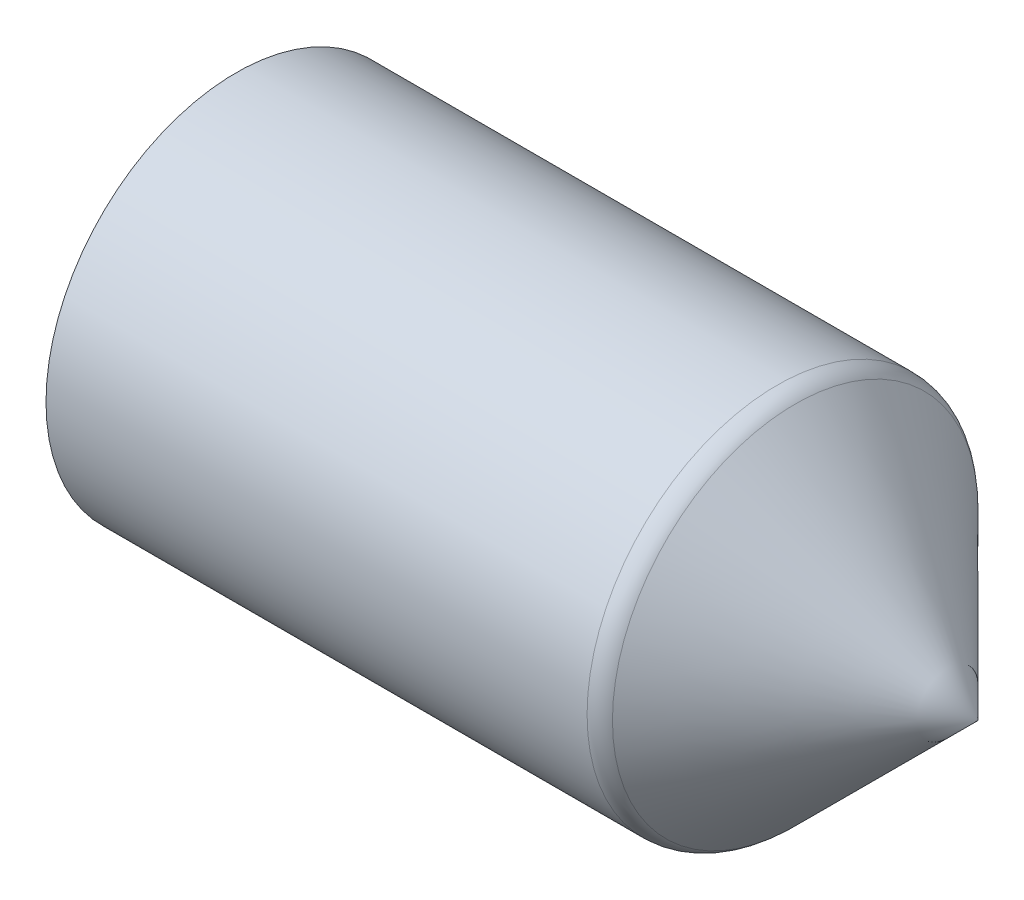
ISO-10303-21;
HEADER;
FILE_DESCRIPTION(('STEP AP214'),'2;1');
FILE_NAME('part.step','',(''),(''),'','','');
FILE_SCHEMA(('AUTOMOTIVE_DESIGN { 1 0 10303 214 1 1 1 1 }'));
ENDSEC;
DATA;
#1=APPLICATION_CONTEXT('core data for automotive mechanical design processes');
#2=APPLICATION_PROTOCOL_DEFINITION('international standard','automotive_design',2000,#1);
#3=PRODUCT_CONTEXT('',#1,'mechanical');
#4=PRODUCT('Part','Part','',(#3));
#5=PRODUCT_RELATED_PRODUCT_CATEGORY('part','',(#4));
#6=PRODUCT_DEFINITION_FORMATION('','',#4);
#7=PRODUCT_DEFINITION_CONTEXT('part definition',#1,'design');
#8=PRODUCT_DEFINITION('design','',#6,#7);
#9=PRODUCT_DEFINITION_SHAPE('','',#8);
#10=(LENGTH_UNIT() NAMED_UNIT(*) SI_UNIT(.MILLI.,.METRE.));
#11=(NAMED_UNIT(*) PLANE_ANGLE_UNIT() SI_UNIT($,.RADIAN.));
#12=(NAMED_UNIT(*) SI_UNIT($,.STERADIAN.) SOLID_ANGLE_UNIT());
#13=UNCERTAINTY_MEASURE_WITH_UNIT(LENGTH_MEASURE(1.E-05),#10,'distance_accuracy_value','');
#14=(GEOMETRIC_REPRESENTATION_CONTEXT(3) GLOBAL_UNCERTAINTY_ASSIGNED_CONTEXT((#13)) GLOBAL_UNIT_ASSIGNED_CONTEXT((#10,
#11,#12)) REPRESENTATION_CONTEXT('',''));
#15=CARTESIAN_POINT('',(0.,0.,0.));
#16=DIRECTION('',(0.,0.,1.));
#17=DIRECTION('',(1.,0.,0.));
#18=AXIS2_PLACEMENT_3D('',#15,#16,#17);
#19=CARTESIAN_POINT('',(0.,0.,0.));
#20=DIRECTION('',(-1.,0.,0.));
#21=DIRECTION('',(0.,0.,1.));
#22=AXIS2_PLACEMENT_3D('',#19,#20,#21);
#23=CYLINDRICAL_SURFACE('',#22,1.5);
#24=CARTESIAN_POINT('',(4.41715728752536,0.,0.));
#25=DIRECTION('',(1.,0.,0.));
#26=DIRECTION('',(0.,0.,-1.));
#27=AXIS2_PLACEMENT_3D('',#24,#25,#26);
#28=CIRCLE('',#27,1.5);
#29=CARTESIAN_POINT('',(4.41715728752536,0.,-1.5));
#30=VERTEX_POINT('',#29);
#31=EDGE_CURVE('E45',#30,#30,#28,.F.);
#32=ORIENTED_EDGE('',*,*,#31,.T.);
#33=EDGE_LOOP('',(#32));
#34=FACE_BOUND('',#33,.T.);
#35=CARTESIAN_POINT('',(0.149999999999999,0.,0.));
#36=DIRECTION('',(1.,0.,0.));
#37=DIRECTION('',(0.,0.,-1.));
#38=AXIS2_PLACEMENT_3D('',#35,#36,#37);
#39=CIRCLE('',#38,1.5);
#40=CARTESIAN_POINT('',(0.149999999999999,0.,-1.5));
#41=VERTEX_POINT('',#40);
#42=EDGE_CURVE('E147',#41,#41,#39,.T.);
#43=ORIENTED_EDGE('',*,*,#42,.T.);
#44=EDGE_LOOP('',(#43));
#45=FACE_BOUND('',#44,.T.);
#46=ADVANCED_FACE('F37',(#34,#45),#23,.T.);
#47=CARTESIAN_POINT('',(0.,1.5,0.));
#48=DIRECTION('',(1.,0.,0.));
#49=DIRECTION('',(0.,0.,-1.));
#50=AXIS2_PLACEMENT_3D('',#47,#48,#49);
#51=PLANE('',#50);
#52=CARTESIAN_POINT('',(0.,0.,0.));
#53=DIRECTION('',(1.,0.,0.));
#54=DIRECTION('',(0.,0.,-1.));
#55=AXIS2_PLACEMENT_3D('',#52,#53,#54);
#56=CIRCLE('',#55,1.24019237886467);
#57=CARTESIAN_POINT('',(0.,0.,-1.24019237886467));
#58=VERTEX_POINT('',#57);
#59=EDGE_CURVE('E137',#58,#58,#56,.F.);
#60=ORIENTED_EDGE('',*,*,#59,.T.);
#61=EDGE_LOOP('',(#60));
#62=FACE_BOUND('',#61,.T.);
#63=DIRECTION('',(0.,0.5,0.866025403784438));
#64=VECTOR('',#63,1.);
#65=CARTESIAN_POINT('',(0.,-0.866025403784439,0.));
#66=LINE('',#65,#64);
#67=CARTESIAN_POINT('',(0.,-0.866025403784439,0.));
#68=VERTEX_POINT('',#67);
#69=CARTESIAN_POINT('',(0.,-0.433012701892219,0.75));
#70=VERTEX_POINT('',#69);
#71=EDGE_CURVE('E125',#68,#70,#66,.T.);
#72=ORIENTED_EDGE('',*,*,#71,.F.);
#73=DIRECTION('',(0.,-0.5,0.866025403784439));
#74=VECTOR('',#73,1.);
#75=CARTESIAN_POINT('',(0.,-0.433012701892219,-0.75));
#76=LINE('',#75,#74);
#77=CARTESIAN_POINT('',(0.,-0.433012701892219,-0.75));
#78=VERTEX_POINT('',#77);
#79=EDGE_CURVE('E52',#78,#68,#76,.T.);
#80=ORIENTED_EDGE('',*,*,#79,.F.);
#81=DIRECTION('',(0.,-1.,0.));
#82=VECTOR('',#81,1.);
#83=CARTESIAN_POINT('',(0.,0.433012701892219,-0.75));
#84=LINE('',#83,#82);
#85=CARTESIAN_POINT('',(0.,0.433012701892219,-0.75));
#86=VERTEX_POINT('',#85);
#87=EDGE_CURVE('E111',#86,#78,#84,.T.);
#88=ORIENTED_EDGE('',*,*,#87,.F.);
#89=DIRECTION('',(0.,-0.5,-0.866025403784438));
#90=VECTOR('',#89,1.);
#91=CARTESIAN_POINT('',(0.,0.866025403784439,0.));
#92=LINE('',#91,#90);
#93=CARTESIAN_POINT('',(0.,0.866025403784439,0.));
#94=VERTEX_POINT('',#93);
#95=EDGE_CURVE('E114',#94,#86,#92,.T.);
#96=ORIENTED_EDGE('',*,*,#95,.F.);
#97=DIRECTION('',(0.,0.5,-0.866025403784439));
#98=VECTOR('',#97,1.);
#99=CARTESIAN_POINT('',(0.,0.43301270189222,0.75));
#100=LINE('',#99,#98);
#101=CARTESIAN_POINT('',(0.,0.43301270189222,0.75));
#102=VERTEX_POINT('',#101);
#103=EDGE_CURVE('E130',#102,#94,#100,.T.);
#104=ORIENTED_EDGE('',*,*,#103,.F.);
#105=DIRECTION('',(0.,1.,0.));
#106=VECTOR('',#105,1.);
#107=CARTESIAN_POINT('',(0.,-0.433012701892219,0.75));
#108=LINE('',#107,#106);
#109=EDGE_CURVE('E127',#70,#102,#108,.T.);
#110=ORIENTED_EDGE('',*,*,#109,.F.);
#111=EDGE_LOOP('',(#72,#80,#88,#96,#104,#110));
#112=FACE_BOUND('',#111,.T.);
#113=ADVANCED_FACE('F163',(#62,#112),#51,.F.);
#114=CARTESIAN_POINT('',(6.,0.,0.));
#115=DIRECTION('',(-1.,0.,0.));
#116=DIRECTION('',(0.,0.,1.));
#117=AXIS2_PLACEMENT_3D('',#114,#115,#116);
#118=CONICAL_SURFACE('',#117,0.,0.785398163397443);
#119=CARTESIAN_POINT('',(4.55857864376267,0.,0.));
#120=DIRECTION('',(1.,0.,0.));
#121=DIRECTION('',(0.,0.,-1.));
#122=AXIS2_PLACEMENT_3D('',#119,#120,#121);
#123=CIRCLE('',#122,1.44142135623731);
#124=CARTESIAN_POINT('',(4.55857864376267,0.,-1.44142135623731));
#125=VERTEX_POINT('',#124);
#126=EDGE_CURVE('E11',#125,#125,#123,.T.);
#127=ORIENTED_EDGE('',*,*,#126,.T.);
#128=EDGE_LOOP('',(#127));
#129=FACE_BOUND('',#128,.T.);
#130=CARTESIAN_POINT('',(6.,0.,0.));
#131=VERTEX_POINT('',#130);
#132=VERTEX_LOOP('',#131);
#133=FACE_BOUND('',#132,.T.);
#134=ADVANCED_FACE('F168',(#129,#133),#118,.T.);
#135=CARTESIAN_POINT('',(2.1,-0.433012701892219,-0.75));
#136=DIRECTION('',(0.,-0.866025403784439,-0.5));
#137=DIRECTION('',(0.,0.5,-0.866025403784439));
#138=AXIS2_PLACEMENT_3D('',#135,#136,#137);
#139=PLANE('',#138);
#140=ORIENTED_EDGE('',*,*,#79,.T.);
#141=DIRECTION('',(-1.,0.,0.));
#142=VECTOR('',#141,1.);
#143=CARTESIAN_POINT('',(2.1,-0.866025403784439,0.));
#144=LINE('',#143,#142);
#145=CARTESIAN_POINT('',(2.1,-0.866025403784439,0.));
#146=VERTEX_POINT('',#145);
#147=EDGE_CURVE('E88',#146,#68,#144,.T.);
#148=ORIENTED_EDGE('',*,*,#147,.F.);
#149=DIRECTION('',(0.,-0.5,0.866025403784439));
#150=VECTOR('',#149,1.);
#151=CARTESIAN_POINT('',(2.1,-0.433012701892219,-0.75));
#152=LINE('',#151,#150);
#153=CARTESIAN_POINT('',(2.1,-0.433012701892219,-0.75));
#154=VERTEX_POINT('',#153);
#155=EDGE_CURVE('E92',#154,#146,#152,.T.);
#156=ORIENTED_EDGE('',*,*,#155,.F.);
#157=DIRECTION('',(-1.,0.,0.));
#158=VECTOR('',#157,1.);
#159=CARTESIAN_POINT('',(2.1,-0.433012701892219,-0.75));
#160=LINE('',#159,#158);
#161=EDGE_CURVE('E135',#154,#78,#160,.T.);
#162=ORIENTED_EDGE('',*,*,#161,.T.);
#163=EDGE_LOOP('',(#140,#148,#156,#162));
#164=FACE_BOUND('',#163,.T.);
#165=ADVANCED_FACE('F90',(#164),#139,.F.);
#166=CARTESIAN_POINT('',(2.1,0.433012701892219,-0.75));
#167=DIRECTION('',(0.,0.,-1.));
#168=DIRECTION('',(0.,1.,0.));
#169=AXIS2_PLACEMENT_3D('',#166,#167,#168);
#170=PLANE('',#169);
#171=ORIENTED_EDGE('',*,*,#87,.T.);
#172=ORIENTED_EDGE('',*,*,#161,.F.);
#173=DIRECTION('',(0.,-1.,0.));
#174=VECTOR('',#173,1.);
#175=CARTESIAN_POINT('',(2.1,0.433012701892219,-0.75));
#176=LINE('',#175,#174);
#177=CARTESIAN_POINT('',(2.1,0.433012701892219,-0.75));
#178=VERTEX_POINT('',#177);
#179=EDGE_CURVE('E98',#178,#154,#176,.T.);
#180=ORIENTED_EDGE('',*,*,#179,.F.);
#181=DIRECTION('',(-1.,0.,0.));
#182=VECTOR('',#181,1.);
#183=CARTESIAN_POINT('',(2.1,0.433012701892219,-0.75));
#184=LINE('',#183,#182);
#185=EDGE_CURVE('E138',#178,#86,#184,.T.);
#186=ORIENTED_EDGE('',*,*,#185,.T.);
#187=EDGE_LOOP('',(#171,#172,#180,#186));
#188=FACE_BOUND('',#187,.T.);
#189=ADVANCED_FACE('F180',(#188),#170,.F.);
#190=CARTESIAN_POINT('',(2.1,0.866025403784439,0.));
#191=DIRECTION('',(0.,0.866025403784439,-0.5));
#192=DIRECTION('',(0.,0.5,0.866025403784439));
#193=AXIS2_PLACEMENT_3D('',#190,#191,#192);
#194=PLANE('',#193);
#195=ORIENTED_EDGE('',*,*,#95,.T.);
#196=ORIENTED_EDGE('',*,*,#185,.F.);
#197=DIRECTION('',(0.,-0.5,-0.866025403784438));
#198=VECTOR('',#197,1.);
#199=CARTESIAN_POINT('',(2.1,0.866025403784439,0.));
#200=LINE('',#199,#198);
#201=CARTESIAN_POINT('',(2.1,0.866025403784439,0.));
#202=VERTEX_POINT('',#201);
#203=EDGE_CURVE('E121',#202,#178,#200,.T.);
#204=ORIENTED_EDGE('',*,*,#203,.F.);
#205=DIRECTION('',(-1.,0.,0.));
#206=VECTOR('',#205,1.);
#207=CARTESIAN_POINT('',(2.1,0.866025403784439,0.));
#208=LINE('',#207,#206);
#209=EDGE_CURVE('E140',#202,#94,#208,.T.);
#210=ORIENTED_EDGE('',*,*,#209,.T.);
#211=EDGE_LOOP('',(#195,#196,#204,#210));
#212=FACE_BOUND('',#211,.T.);
#213=ADVANCED_FACE('F190',(#212),#194,.F.);
#214=CARTESIAN_POINT('',(2.1,0.43301270189222,0.75));
#215=DIRECTION('',(0.,0.866025403784439,0.5));
#216=DIRECTION('',(0.,-0.5,0.866025403784439));
#217=AXIS2_PLACEMENT_3D('',#214,#215,#216);
#218=PLANE('',#217);
#219=ORIENTED_EDGE('',*,*,#103,.T.);
#220=ORIENTED_EDGE('',*,*,#209,.F.);
#221=DIRECTION('',(0.,0.5,-0.866025403784439));
#222=VECTOR('',#221,1.);
#223=CARTESIAN_POINT('',(2.1,0.43301270189222,0.75));
#224=LINE('',#223,#222);
#225=CARTESIAN_POINT('',(2.1,0.43301270189222,0.75));
#226=VERTEX_POINT('',#225);
#227=EDGE_CURVE('E118',#226,#202,#224,.T.);
#228=ORIENTED_EDGE('',*,*,#227,.F.);
#229=DIRECTION('',(-1.,0.,0.));
#230=VECTOR('',#229,1.);
#231=CARTESIAN_POINT('',(2.1,0.43301270189222,0.75));
#232=LINE('',#231,#230);
#233=EDGE_CURVE('E142',#226,#102,#232,.T.);
#234=ORIENTED_EDGE('',*,*,#233,.T.);
#235=EDGE_LOOP('',(#219,#220,#228,#234));
#236=FACE_BOUND('',#235,.T.);
#237=ADVANCED_FACE('F186',(#236),#218,.F.);
#238=CARTESIAN_POINT('',(2.1,-0.433012701892219,0.75));
#239=DIRECTION('',(0.,0.,1.));
#240=DIRECTION('',(1.,0.,0.));
#241=AXIS2_PLACEMENT_3D('',#238,#239,#240);
#242=PLANE('',#241);
#243=ORIENTED_EDGE('',*,*,#109,.T.);
#244=ORIENTED_EDGE('',*,*,#233,.F.);
#245=DIRECTION('',(0.,1.,0.));
#246=VECTOR('',#245,1.);
#247=CARTESIAN_POINT('',(2.1,-0.433012701892219,0.75));
#248=LINE('',#247,#246);
#249=CARTESIAN_POINT('',(2.1,-0.433012701892219,0.75));
#250=VERTEX_POINT('',#249);
#251=EDGE_CURVE('E106',#250,#226,#248,.T.);
#252=ORIENTED_EDGE('',*,*,#251,.F.);
#253=DIRECTION('',(-1.,0.,0.));
#254=VECTOR('',#253,1.);
#255=CARTESIAN_POINT('',(2.1,-0.433012701892219,0.75));
#256=LINE('',#255,#254);
#257=EDGE_CURVE('E97',#250,#70,#256,.T.);
#258=ORIENTED_EDGE('',*,*,#257,.T.);
#259=EDGE_LOOP('',(#243,#244,#252,#258));
#260=FACE_BOUND('',#259,.T.);
#261=ADVANCED_FACE('F183',(#260),#242,.F.);
#262=CARTESIAN_POINT('',(2.1,-0.866025403784439,0.));
#263=DIRECTION('',(0.,-0.866025403784438,0.5));
#264=DIRECTION('',(0.,-0.5,-0.866025403784439));
#265=AXIS2_PLACEMENT_3D('',#262,#263,#264);
#266=PLANE('',#265);
#267=ORIENTED_EDGE('',*,*,#71,.T.);
#268=ORIENTED_EDGE('',*,*,#257,.F.);
#269=DIRECTION('',(0.,0.5,0.866025403784438));
#270=VECTOR('',#269,1.);
#271=CARTESIAN_POINT('',(2.1,-0.866025403784439,0.));
#272=LINE('',#271,#270);
#273=EDGE_CURVE('E101',#146,#250,#272,.T.);
#274=ORIENTED_EDGE('',*,*,#273,.F.);
#275=ORIENTED_EDGE('',*,*,#147,.T.);
#276=EDGE_LOOP('',(#267,#268,#274,#275));
#277=FACE_BOUND('',#276,.T.);
#278=ADVANCED_FACE('F102',(#277),#266,.F.);
#279=CARTESIAN_POINT('',(2.1,0.,0.));
#280=DIRECTION('',(-1.,0.,0.));
#281=DIRECTION('',(0.,0.,1.));
#282=AXIS2_PLACEMENT_3D('',#279,#280,#281);
#283=PLANE('',#282);
#284=ORIENTED_EDGE('',*,*,#155,.T.);
#285=ORIENTED_EDGE('',*,*,#273,.T.);
#286=ORIENTED_EDGE('',*,*,#251,.T.);
#287=ORIENTED_EDGE('',*,*,#227,.T.);
#288=ORIENTED_EDGE('',*,*,#203,.T.);
#289=ORIENTED_EDGE('',*,*,#179,.T.);
#290=EDGE_LOOP('',(#284,#285,#286,#287,#288,#289));
#291=FACE_BOUND('',#290,.T.);
#292=ADVANCED_FACE('F108',(#291),#283,.T.);
#293=CARTESIAN_POINT('',(0.,0.,0.));
#294=DIRECTION('',(1.,0.,0.));
#295=DIRECTION('',(0.,0.,-1.));
#296=AXIS2_PLACEMENT_3D('',#293,#294,#295);
#297=CONICAL_SURFACE('',#296,1.24019237886467,1.0471975511966);
#298=ORIENTED_EDGE('',*,*,#42,.F.);
#299=EDGE_LOOP('',(#298));
#300=FACE_BOUND('',#299,.T.);
#301=ORIENTED_EDGE('',*,*,#59,.F.);
#302=EDGE_LOOP('',(#301));
#303=FACE_BOUND('',#302,.T.);
#304=ADVANCED_FACE('F155',(#300,#303),#297,.T.);
#305=CARTESIAN_POINT('',(4.41715728752536,0.,0.));
#306=DIRECTION('',(1.,0.,0.));
#307=DIRECTION('',(0.,0.,-1.));
#308=AXIS2_PLACEMENT_3D('',#305,#306,#307);
#309=TOROIDAL_SURFACE('',#308,1.3,0.2);
#310=ORIENTED_EDGE('',*,*,#126,.F.);
#311=EDGE_LOOP('',(#310));
#312=FACE_BOUND('',#311,.T.);
#313=ORIENTED_EDGE('',*,*,#31,.F.);
#314=EDGE_LOOP('',(#313));
#315=FACE_BOUND('',#314,.T.);
#316=ADVANCED_FACE('F39',(#312,#315),#309,.T.);
#317=CLOSED_SHELL('',(#46,#113,#134,#165,#189,#213,#237,#261,#278,#292,#304,#316));
#318=MANIFOLD_SOLID_BREP('B2',#317);
#319=ADVANCED_BREP_SHAPE_REPRESENTATION('',(#18,#318),#14);
#320=SHAPE_DEFINITION_REPRESENTATION(#9,#319);
ENDSEC;
END-ISO-10303-21;
